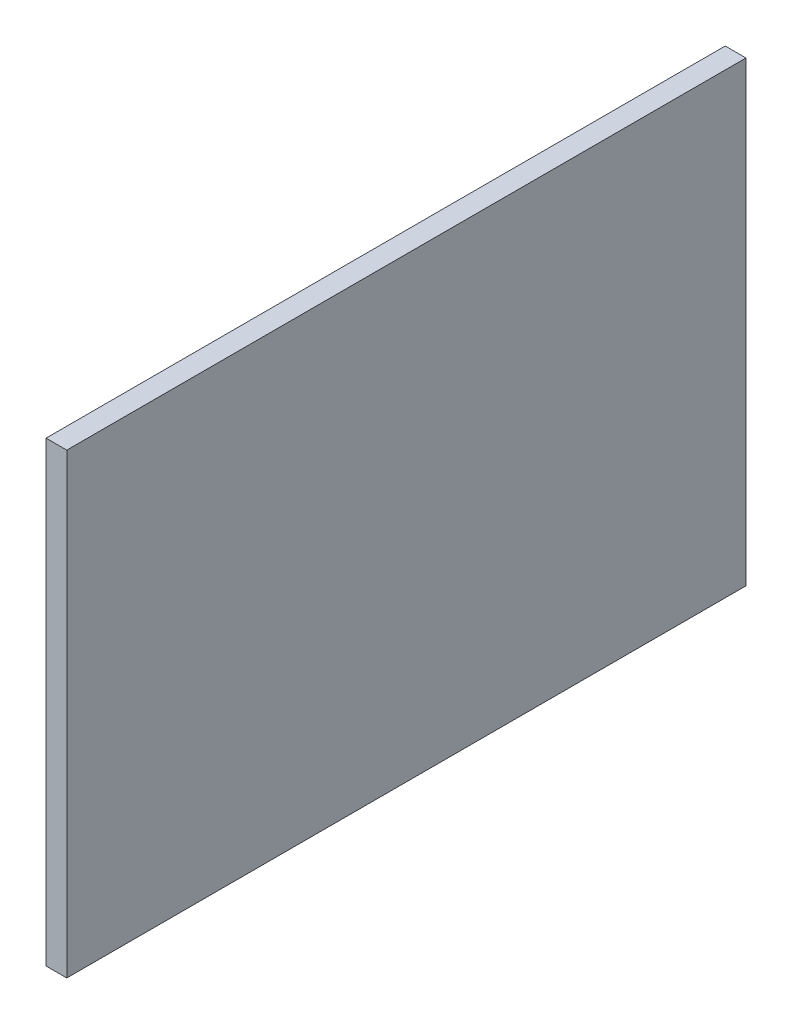
ISO-10303-21;
HEADER;
FILE_DESCRIPTION(('STEP AP214'),'2;1');
FILE_NAME('part.step','',(''),(''),'','','');
FILE_SCHEMA(('AUTOMOTIVE_DESIGN { 1 0 10303 214 1 1 1 1 }'));
ENDSEC;
DATA;
#1=APPLICATION_CONTEXT('core data for automotive mechanical design processes');
#2=APPLICATION_PROTOCOL_DEFINITION('international standard','automotive_design',2000,#1);
#3=PRODUCT_CONTEXT('',#1,'mechanical');
#4=PRODUCT('Part','Part','',(#3));
#5=PRODUCT_RELATED_PRODUCT_CATEGORY('part','',(#4));
#6=PRODUCT_DEFINITION_FORMATION('','',#4);
#7=PRODUCT_DEFINITION_CONTEXT('part definition',#1,'design');
#8=PRODUCT_DEFINITION('design','',#6,#7);
#9=PRODUCT_DEFINITION_SHAPE('','',#8);
#10=(LENGTH_UNIT() NAMED_UNIT(*) SI_UNIT(.MILLI.,.METRE.));
#11=(NAMED_UNIT(*) PLANE_ANGLE_UNIT() SI_UNIT($,.RADIAN.));
#12=(NAMED_UNIT(*) SI_UNIT($,.STERADIAN.) SOLID_ANGLE_UNIT());
#13=UNCERTAINTY_MEASURE_WITH_UNIT(LENGTH_MEASURE(1.E-05),#10,'distance_accuracy_value','');
#14=(GEOMETRIC_REPRESENTATION_CONTEXT(3) GLOBAL_UNCERTAINTY_ASSIGNED_CONTEXT((#13)) GLOBAL_UNIT_ASSIGNED_CONTEXT((#10,
#11,#12)) REPRESENTATION_CONTEXT('',''));
#15=CARTESIAN_POINT('',(0.,0.,0.));
#16=DIRECTION('',(0.,0.,1.));
#17=DIRECTION('',(1.,0.,0.));
#18=AXIS2_PLACEMENT_3D('',#15,#16,#17);
#19=CARTESIAN_POINT('',(3.175,0.,0.));
#20=DIRECTION('',(0.,0.,-1.));
#21=DIRECTION('',(-1.,0.,0.));
#22=AXIS2_PLACEMENT_3D('',#19,#20,#21);
#23=PLANE('',#22);
#24=DIRECTION('',(0.,-1.,0.));
#25=VECTOR('',#24,1.);
#26=CARTESIAN_POINT('',(0.,0.,0.));
#27=LINE('',#26,#25);
#28=CARTESIAN_POINT('',(0.,70.,0.));
#29=VERTEX_POINT('',#28);
#30=CARTESIAN_POINT('',(0.,0.,0.));
#31=VERTEX_POINT('',#30);
#32=EDGE_CURVE('E96',#29,#31,#27,.T.);
#33=ORIENTED_EDGE('',*,*,#32,.T.);
#34=DIRECTION('',(-1.,0.,0.));
#35=VECTOR('',#34,1.);
#36=CARTESIAN_POINT('',(3.175,0.,0.));
#37=LINE('',#36,#35);
#38=CARTESIAN_POINT('',(3.175,0.,0.));
#39=VERTEX_POINT('',#38);
#40=EDGE_CURVE('E11',#39,#31,#37,.T.);
#41=ORIENTED_EDGE('',*,*,#40,.F.);
#42=DIRECTION('',(0.,-1.,0.));
#43=VECTOR('',#42,1.);
#44=CARTESIAN_POINT('',(3.175,0.,0.));
#45=LINE('',#44,#43);
#46=CARTESIAN_POINT('',(3.175,70.,0.));
#47=VERTEX_POINT('',#46);
#48=EDGE_CURVE('E84',#47,#39,#45,.T.);
#49=ORIENTED_EDGE('',*,*,#48,.F.);
#50=DIRECTION('',(-1.,0.,0.));
#51=VECTOR('',#50,1.);
#52=CARTESIAN_POINT('',(3.175,70.,0.));
#53=LINE('',#52,#51);
#54=EDGE_CURVE('E92',#47,#29,#53,.T.);
#55=ORIENTED_EDGE('',*,*,#54,.T.);
#56=EDGE_LOOP('',(#33,#41,#49,#55));
#57=FACE_BOUND('',#56,.T.);
#58=ADVANCED_FACE('F33',(#57),#23,.F.);
#59=CARTESIAN_POINT('',(3.175,0.,0.));
#60=DIRECTION('',(0.,1.,0.));
#61=DIRECTION('',(0.,0.,1.));
#62=AXIS2_PLACEMENT_3D('',#59,#60,#61);
#63=PLANE('',#62);
#64=DIRECTION('',(0.,0.,-1.));
#65=VECTOR('',#64,1.);
#66=CARTESIAN_POINT('',(0.,0.,0.));
#67=LINE('',#66,#65);
#68=CARTESIAN_POINT('',(0.,0.,-104.));
#69=VERTEX_POINT('',#68);
#70=EDGE_CURVE('E88',#31,#69,#67,.T.);
#71=ORIENTED_EDGE('',*,*,#70,.T.);
#72=DIRECTION('',(-1.,0.,0.));
#73=VECTOR('',#72,1.);
#74=CARTESIAN_POINT('',(3.175,0.,-104.));
#75=LINE('',#74,#73);
#76=CARTESIAN_POINT('',(3.175,0.,-104.));
#77=VERTEX_POINT('',#76);
#78=EDGE_CURVE('E41',#77,#69,#75,.T.);
#79=ORIENTED_EDGE('',*,*,#78,.F.);
#80=DIRECTION('',(0.,0.,-1.));
#81=VECTOR('',#80,1.);
#82=CARTESIAN_POINT('',(3.175,0.,0.));
#83=LINE('',#82,#81);
#84=EDGE_CURVE('E79',#39,#77,#83,.T.);
#85=ORIENTED_EDGE('',*,*,#84,.F.);
#86=ORIENTED_EDGE('',*,*,#40,.T.);
#87=EDGE_LOOP('',(#71,#79,#85,#86));
#88=FACE_BOUND('',#87,.T.);
#89=ADVANCED_FACE('F87',(#88),#63,.F.);
#90=CARTESIAN_POINT('',(3.175,0.,-104.));
#91=DIRECTION('',(0.,0.,1.));
#92=DIRECTION('',(1.,0.,0.));
#93=AXIS2_PLACEMENT_3D('',#90,#91,#92);
#94=PLANE('',#93);
#95=DIRECTION('',(0.,1.,0.));
#96=VECTOR('',#95,1.);
#97=CARTESIAN_POINT('',(0.,0.,-104.));
#98=LINE('',#97,#96);
#99=CARTESIAN_POINT('',(0.,70.,-104.));
#100=VERTEX_POINT('',#99);
#101=EDGE_CURVE('E66',#69,#100,#98,.T.);
#102=ORIENTED_EDGE('',*,*,#101,.T.);
#103=DIRECTION('',(-1.,0.,0.));
#104=VECTOR('',#103,1.);
#105=CARTESIAN_POINT('',(3.175,70.,-104.));
#106=LINE('',#105,#104);
#107=CARTESIAN_POINT('',(3.175,70.,-104.));
#108=VERTEX_POINT('',#107);
#109=EDGE_CURVE('E89',#108,#100,#106,.T.);
#110=ORIENTED_EDGE('',*,*,#109,.F.);
#111=DIRECTION('',(0.,1.,0.));
#112=VECTOR('',#111,1.);
#113=CARTESIAN_POINT('',(3.175,0.,-104.));
#114=LINE('',#113,#112);
#115=EDGE_CURVE('E82',#77,#108,#114,.T.);
#116=ORIENTED_EDGE('',*,*,#115,.F.);
#117=ORIENTED_EDGE('',*,*,#78,.T.);
#118=EDGE_LOOP('',(#102,#110,#116,#117));
#119=FACE_BOUND('',#118,.T.);
#120=ADVANCED_FACE('F90',(#119),#94,.F.);
#121=CARTESIAN_POINT('',(3.175,70.,0.));
#122=DIRECTION('',(0.,-1.,0.));
#123=DIRECTION('',(0.,0.,-1.));
#124=AXIS2_PLACEMENT_3D('',#121,#122,#123);
#125=PLANE('',#124);
#126=DIRECTION('',(0.,0.,1.));
#127=VECTOR('',#126,1.);
#128=CARTESIAN_POINT('',(0.,70.,0.));
#129=LINE('',#128,#127);
#130=EDGE_CURVE('E72',#100,#29,#129,.T.);
#131=ORIENTED_EDGE('',*,*,#130,.T.);
#132=ORIENTED_EDGE('',*,*,#54,.F.);
#133=DIRECTION('',(0.,0.,1.));
#134=VECTOR('',#133,1.);
#135=CARTESIAN_POINT('',(3.175,70.,0.));
#136=LINE('',#135,#134);
#137=EDGE_CURVE('E49',#108,#47,#136,.T.);
#138=ORIENTED_EDGE('',*,*,#137,.F.);
#139=ORIENTED_EDGE('',*,*,#109,.T.);
#140=EDGE_LOOP('',(#131,#132,#138,#139));
#141=FACE_BOUND('',#140,.T.);
#142=ADVANCED_FACE('F103',(#141),#125,.F.);
#143=CARTESIAN_POINT('',(3.175,0.,0.));
#144=DIRECTION('',(-1.,0.,0.));
#145=DIRECTION('',(0.,0.,1.));
#146=AXIS2_PLACEMENT_3D('',#143,#144,#145);
#147=PLANE('',#146);
#148=ORIENTED_EDGE('',*,*,#48,.T.);
#149=ORIENTED_EDGE('',*,*,#84,.T.);
#150=ORIENTED_EDGE('',*,*,#115,.T.);
#151=ORIENTED_EDGE('',*,*,#137,.T.);
#152=EDGE_LOOP('',(#148,#149,#150,#151));
#153=FACE_BOUND('',#152,.T.);
#154=ADVANCED_FACE('F80',(#153),#147,.F.);
#155=CARTESIAN_POINT('',(0.,0.,0.));
#156=DIRECTION('',(-1.,0.,0.));
#157=DIRECTION('',(0.,0.,1.));
#158=AXIS2_PLACEMENT_3D('',#155,#156,#157);
#159=PLANE('',#158);
#160=ORIENTED_EDGE('',*,*,#32,.F.);
#161=ORIENTED_EDGE('',*,*,#130,.F.);
#162=ORIENTED_EDGE('',*,*,#101,.F.);
#163=ORIENTED_EDGE('',*,*,#70,.F.);
#164=EDGE_LOOP('',(#160,#161,#162,#163));
#165=FACE_BOUND('',#164,.T.);
#166=ADVANCED_FACE('F106',(#165),#159,.T.);
#167=CLOSED_SHELL('',(#58,#89,#120,#142,#154,#166));
#168=MANIFOLD_SOLID_BREP('B2',#167);
#169=ADVANCED_BREP_SHAPE_REPRESENTATION('',(#18,#168),#14);
#170=SHAPE_DEFINITION_REPRESENTATION(#9,#169);
ENDSEC;
END-ISO-10303-21;
